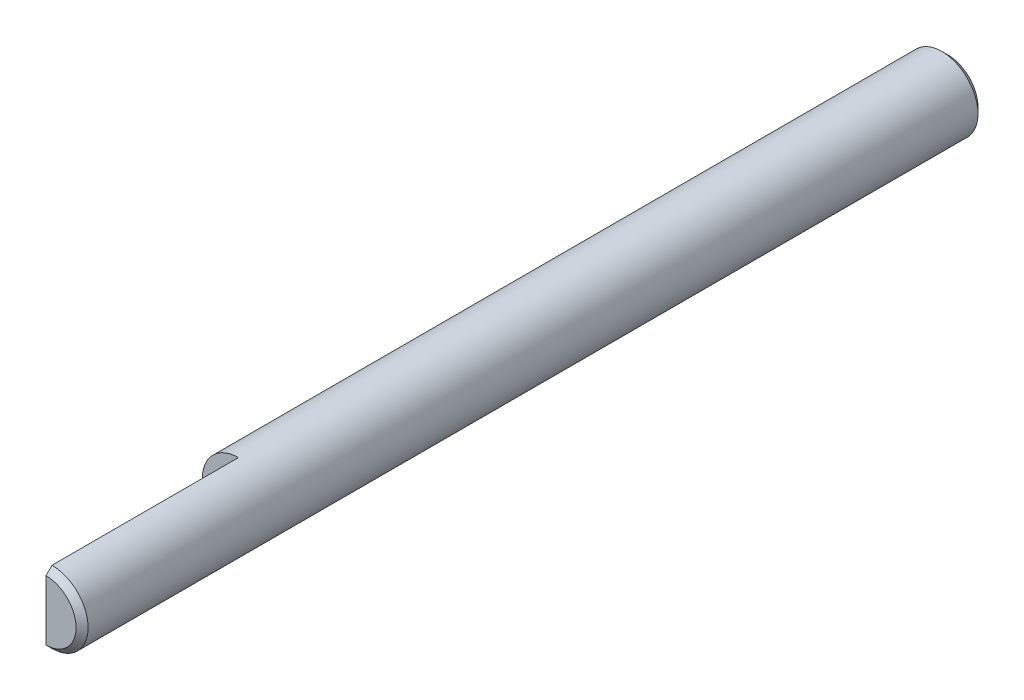
ISO-10303-21;
HEADER;
FILE_DESCRIPTION(('STEP AP214'),'2;1');
FILE_NAME('part.step','',(''),(''),'','','');
FILE_SCHEMA(('AUTOMOTIVE_DESIGN { 1 0 10303 214 1 1 1 1 }'));
ENDSEC;
DATA;
#1=APPLICATION_CONTEXT('core data for automotive mechanical design processes');
#2=APPLICATION_PROTOCOL_DEFINITION('international standard','automotive_design',2000,#1);
#3=PRODUCT_CONTEXT('',#1,'mechanical');
#4=PRODUCT('Part','Part','',(#3));
#5=PRODUCT_RELATED_PRODUCT_CATEGORY('part','',(#4));
#6=PRODUCT_DEFINITION_FORMATION('','',#4);
#7=PRODUCT_DEFINITION_CONTEXT('part definition',#1,'design');
#8=PRODUCT_DEFINITION('design','',#6,#7);
#9=PRODUCT_DEFINITION_SHAPE('','',#8);
#10=(LENGTH_UNIT() NAMED_UNIT(*) SI_UNIT(.MILLI.,.METRE.));
#11=(NAMED_UNIT(*) PLANE_ANGLE_UNIT() SI_UNIT($,.RADIAN.));
#12=(NAMED_UNIT(*) SI_UNIT($,.STERADIAN.) SOLID_ANGLE_UNIT());
#13=UNCERTAINTY_MEASURE_WITH_UNIT(LENGTH_MEASURE(1.E-05),#10,'distance_accuracy_value','');
#14=(GEOMETRIC_REPRESENTATION_CONTEXT(3) GLOBAL_UNCERTAINTY_ASSIGNED_CONTEXT((#13)) GLOBAL_UNIT_ASSIGNED_CONTEXT((#10,
#11,#12)) REPRESENTATION_CONTEXT('',''));
#15=CARTESIAN_POINT('',(0.,0.,0.));
#16=DIRECTION('',(0.,0.,1.));
#17=DIRECTION('',(1.,0.,0.));
#18=AXIS2_PLACEMENT_3D('',#15,#16,#17);
#19=CARTESIAN_POINT('',(0.,0.,75.));
#20=DIRECTION('',(0.,0.,-1.));
#21=DIRECTION('',(-1.,0.,0.));
#22=AXIS2_PLACEMENT_3D('',#19,#20,#21);
#23=CYLINDRICAL_SURFACE('',#22,3.);
#24=CARTESIAN_POINT('',(0.,0.,74.5));
#25=DIRECTION('',(0.,0.,1.));
#26=DIRECTION('',(1.,0.,0.));
#27=AXIS2_PLACEMENT_3D('',#24,#25,#26);
#28=CIRCLE('',#27,3.);
#29=CARTESIAN_POINT('',(0.,3.,74.5));
#30=VERTEX_POINT('',#29);
#31=CARTESIAN_POINT('',(0.,-3.,74.5));
#32=VERTEX_POINT('',#31);
#33=EDGE_CURVE('E85',#30,#32,#28,.F.);
#34=ORIENTED_EDGE('',*,*,#33,.T.);
#35=DIRECTION('',(0.,0.,1.));
#36=VECTOR('',#35,1.);
#37=CARTESIAN_POINT('',(0.,-3.,59.));
#38=LINE('',#37,#36);
#39=CARTESIAN_POINT('',(0.,-3.,59.));
#40=VERTEX_POINT('',#39);
#41=EDGE_CURVE('E78',#40,#32,#38,.T.);
#42=ORIENTED_EDGE('',*,*,#41,.F.);
#43=CARTESIAN_POINT('',(0.,0.,59.));
#44=DIRECTION('',(0.,0.,1.));
#45=DIRECTION('',(1.,0.,0.));
#46=AXIS2_PLACEMENT_3D('',#43,#44,#45);
#47=CIRCLE('',#46,3.);
#48=CARTESIAN_POINT('',(0.,3.,59.));
#49=VERTEX_POINT('',#48);
#50=EDGE_CURVE('E70',#49,#40,#47,.T.);
#51=ORIENTED_EDGE('',*,*,#50,.F.);
#52=DIRECTION('',(0.,0.,1.));
#53=VECTOR('',#52,1.);
#54=CARTESIAN_POINT('',(0.,3.,59.));
#55=LINE('',#54,#53);
#56=EDGE_CURVE('E80',#49,#30,#55,.T.);
#57=ORIENTED_EDGE('',*,*,#56,.T.);
#58=EDGE_LOOP('',(#34,#42,#51,#57));
#59=FACE_BOUND('',#58,.T.);
#60=CARTESIAN_POINT('',(0.,0.,0.500000000000014));
#61=DIRECTION('',(0.,0.,1.));
#62=DIRECTION('',(1.,0.,0.));
#63=AXIS2_PLACEMENT_3D('',#60,#61,#62);
#64=CIRCLE('',#63,3.);
#65=CARTESIAN_POINT('',(3.,0.,0.500000000000014));
#66=VERTEX_POINT('',#65);
#67=EDGE_CURVE('E91',#66,#66,#64,.T.);
#68=ORIENTED_EDGE('',*,*,#67,.T.);
#69=EDGE_LOOP('',(#68));
#70=FACE_BOUND('',#69,.T.);
#71=ADVANCED_FACE('F39',(#59,#70),#23,.T.);
#72=CARTESIAN_POINT('',(0.,0.,75.));
#73=DIRECTION('',(0.,0.,1.));
#74=DIRECTION('',(1.,0.,0.));
#75=AXIS2_PLACEMENT_3D('',#72,#73,#74);
#76=PLANE('',#75);
#77=DIRECTION('',(0.,1.,0.));
#78=VECTOR('',#77,1.);
#79=CARTESIAN_POINT('',(0.,-3.,75.));
#80=LINE('',#79,#78);
#81=CARTESIAN_POINT('',(0.,-2.49999999999999,75.));
#82=VERTEX_POINT('',#81);
#83=CARTESIAN_POINT('',(0.,2.5,75.));
#84=VERTEX_POINT('',#83);
#85=EDGE_CURVE('E53',#82,#84,#80,.T.);
#86=ORIENTED_EDGE('',*,*,#85,.F.);
#87=CARTESIAN_POINT('',(0.,0.,75.));
#88=DIRECTION('',(0.,0.,1.));
#89=DIRECTION('',(1.,0.,0.));
#90=AXIS2_PLACEMENT_3D('',#87,#88,#89);
#91=CIRCLE('',#90,2.5);
#92=EDGE_CURVE('E97',#82,#84,#91,.T.);
#93=ORIENTED_EDGE('',*,*,#92,.T.);
#94=EDGE_LOOP('',(#86,#93));
#95=FACE_BOUND('',#94,.T.);
#96=ADVANCED_FACE('F101',(#95),#76,.T.);
#97=CARTESIAN_POINT('',(0.,0.,0.));
#98=DIRECTION('',(0.,0.,1.));
#99=DIRECTION('',(1.,0.,0.));
#100=AXIS2_PLACEMENT_3D('',#97,#98,#99);
#101=PLANE('',#100);
#102=CARTESIAN_POINT('',(0.,0.,0.));
#103=DIRECTION('',(0.,0.,1.));
#104=DIRECTION('',(1.,0.,0.));
#105=AXIS2_PLACEMENT_3D('',#102,#103,#104);
#106=CIRCLE('',#105,2.49999999999999);
#107=CARTESIAN_POINT('',(2.49999999999999,0.,0.));
#108=VERTEX_POINT('',#107);
#109=EDGE_CURVE('E94',#108,#108,#106,.F.);
#110=ORIENTED_EDGE('',*,*,#109,.T.);
#111=EDGE_LOOP('',(#110));
#112=FACE_BOUND('',#111,.T.);
#113=ADVANCED_FACE('F110',(#112),#101,.F.);
#114=CARTESIAN_POINT('',(0.,0.,0.500000000000014));
#115=DIRECTION('',(0.,0.,1.));
#116=DIRECTION('',(1.,0.,0.));
#117=AXIS2_PLACEMENT_3D('',#114,#115,#116);
#118=CONICAL_SURFACE('',#117,3.,0.785398163397446);
#119=ORIENTED_EDGE('',*,*,#109,.F.);
#120=EDGE_LOOP('',(#119));
#121=FACE_BOUND('',#120,.T.);
#122=ORIENTED_EDGE('',*,*,#67,.F.);
#123=EDGE_LOOP('',(#122));
#124=FACE_BOUND('',#123,.T.);
#125=ADVANCED_FACE('F104',(#121,#124),#118,.T.);
#126=CARTESIAN_POINT('',(0.,0.,75.));
#127=DIRECTION('',(0.,0.,-1.));
#128=DIRECTION('',(-1.,0.,0.));
#129=AXIS2_PLACEMENT_3D('',#126,#127,#128);
#130=CONICAL_SURFACE('',#129,2.5,0.785398163397439);
#131=DIRECTION('',(0.,-0.707106781186541,-0.707106781186554));
#132=VECTOR('',#131,1.);
#133=CARTESIAN_POINT('',(0.,0.,77.5));
#134=LINE('',#133,#132);
#135=EDGE_CURVE('E11',#32,#82,#134,.F.);
#136=ORIENTED_EDGE('',*,*,#135,.F.);
#137=ORIENTED_EDGE('',*,*,#33,.F.);
#138=DIRECTION('',(0.,-0.707106781186541,0.707106781186554));
#139=VECTOR('',#138,1.);
#140=CARTESIAN_POINT('',(0.,0.,77.5));
#141=LINE('',#140,#139);
#142=EDGE_CURVE('E47',#84,#30,#141,.F.);
#143=ORIENTED_EDGE('',*,*,#142,.F.);
#144=ORIENTED_EDGE('',*,*,#92,.F.);
#145=EDGE_LOOP('',(#136,#137,#143,#144));
#146=FACE_BOUND('',#145,.T.);
#147=ADVANCED_FACE('F41',(#146),#130,.T.);
#148=CARTESIAN_POINT('',(0.,-3.,59.));
#149=DIRECTION('',(1.,0.,0.));
#150=DIRECTION('',(0.,0.,-1.));
#151=AXIS2_PLACEMENT_3D('',#148,#149,#150);
#152=PLANE('',#151);
#153=ORIENTED_EDGE('',*,*,#135,.T.);
#154=ORIENTED_EDGE('',*,*,#85,.T.);
#155=ORIENTED_EDGE('',*,*,#142,.T.);
#156=ORIENTED_EDGE('',*,*,#56,.F.);
#157=DIRECTION('',(0.,1.,0.));
#158=VECTOR('',#157,1.);
#159=CARTESIAN_POINT('',(0.,-3.,59.));
#160=LINE('',#159,#158);
#161=EDGE_CURVE('E73',#40,#49,#160,.T.);
#162=ORIENTED_EDGE('',*,*,#161,.F.);
#163=ORIENTED_EDGE('',*,*,#41,.T.);
#164=EDGE_LOOP('',(#153,#154,#155,#156,#162,#163));
#165=FACE_BOUND('',#164,.T.);
#166=ADVANCED_FACE('F77',(#165),#152,.F.);
#167=CARTESIAN_POINT('',(0.,0.,59.));
#168=DIRECTION('',(0.,0.,1.));
#169=DIRECTION('',(1.,0.,0.));
#170=AXIS2_PLACEMENT_3D('',#167,#168,#169);
#171=PLANE('',#170);
#172=ORIENTED_EDGE('',*,*,#50,.T.);
#173=ORIENTED_EDGE('',*,*,#161,.T.);
#174=EDGE_LOOP('',(#172,#173));
#175=FACE_BOUND('',#174,.T.);
#176=ADVANCED_FACE('F72',(#175),#171,.T.);
#177=CLOSED_SHELL('',(#71,#96,#113,#125,#147,#166,#176));
#178=MANIFOLD_SOLID_BREP('B2',#177);
#179=ADVANCED_BREP_SHAPE_REPRESENTATION('',(#18,#178),#14);
#180=SHAPE_DEFINITION_REPRESENTATION(#9,#179);
ENDSEC;
END-ISO-10303-21;
